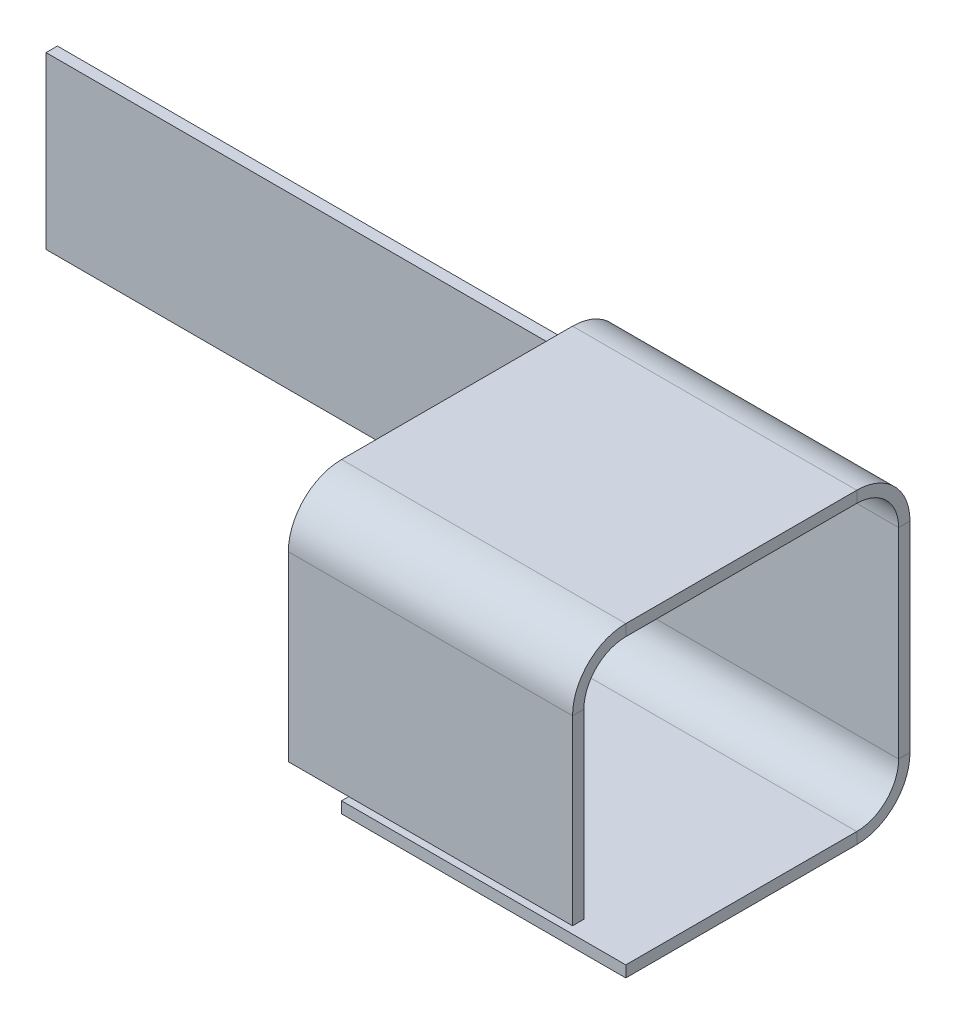
ISO-10303-21;
HEADER;
FILE_DESCRIPTION(('STEP AP214'),'2;1');
FILE_NAME('part.step','',(''),(''),'','','');
FILE_SCHEMA(('AUTOMOTIVE_DESIGN { 1 0 10303 214 1 1 1 1 }'));
ENDSEC;
DATA;
#1=APPLICATION_CONTEXT('core data for automotive mechanical design processes');
#2=APPLICATION_PROTOCOL_DEFINITION('international standard','automotive_design',2000,#1);
#3=PRODUCT_CONTEXT('',#1,'mechanical');
#4=PRODUCT('Part','Part','',(#3));
#5=PRODUCT_RELATED_PRODUCT_CATEGORY('part','',(#4));
#6=PRODUCT_DEFINITION_FORMATION('','',#4);
#7=PRODUCT_DEFINITION_CONTEXT('part definition',#1,'design');
#8=PRODUCT_DEFINITION('design','',#6,#7);
#9=PRODUCT_DEFINITION_SHAPE('','',#8);
#10=(LENGTH_UNIT() NAMED_UNIT(*) SI_UNIT(.MILLI.,.METRE.));
#11=(NAMED_UNIT(*) PLANE_ANGLE_UNIT() SI_UNIT($,.RADIAN.));
#12=(NAMED_UNIT(*) SI_UNIT($,.STERADIAN.) SOLID_ANGLE_UNIT());
#13=UNCERTAINTY_MEASURE_WITH_UNIT(LENGTH_MEASURE(1.E-05),#10,'distance_accuracy_value','');
#14=(GEOMETRIC_REPRESENTATION_CONTEXT(3) GLOBAL_UNCERTAINTY_ASSIGNED_CONTEXT((#13)) GLOBAL_UNIT_ASSIGNED_CONTEXT((#10,
#11,#12)) REPRESENTATION_CONTEXT('',''));
#15=CARTESIAN_POINT('',(0.,0.,0.));
#16=DIRECTION('',(0.,0.,1.));
#17=DIRECTION('',(1.,0.,0.));
#18=AXIS2_PLACEMENT_3D('',#15,#16,#17);
#19=CARTESIAN_POINT('',(-2.50000000000002,2.50000000000001,0.2));
#20=DIRECTION('',(1.,0.,0.));
#21=DIRECTION('',(0.,0.,-1.));
#22=AXIS2_PLACEMENT_3D('',#19,#20,#21);
#23=PLANE('',#22);
#24=DIRECTION('',(0.,0.,-1.));
#25=VECTOR('',#24,1.);
#26=CARTESIAN_POINT('',(-2.50000000000002,1.49999999999999,0.200000000000001));
#27=LINE('',#26,#25);
#28=CARTESIAN_POINT('',(-2.50000000000002,1.49999999999999,0.2));
#29=VERTEX_POINT('',#28);
#30=CARTESIAN_POINT('',(-2.50000000000002,1.49999999999999,0.));
#31=VERTEX_POINT('',#30);
#32=EDGE_CURVE('E77',#29,#31,#27,.T.);
#33=ORIENTED_EDGE('',*,*,#32,.F.);
#34=DIRECTION('',(0.,-1.,0.));
#35=VECTOR('',#34,1.);
#36=CARTESIAN_POINT('',(-2.50000000000002,2.50000000000001,0.2));
#37=LINE('',#36,#35);
#38=CARTESIAN_POINT('',(-2.50000000000002,1.76340000000001,0.200000000000001));
#39=VERTEX_POINT('',#38);
#40=EDGE_CURVE('E61',#39,#29,#37,.T.);
#41=ORIENTED_EDGE('',*,*,#40,.F.);
#42=DIRECTION('',(0.,0.,-1.));
#43=VECTOR('',#42,1.);
#44=CARTESIAN_POINT('',(-2.50000000000002,1.76340000000001,0.200000000000001));
#45=LINE('',#44,#43);
#46=CARTESIAN_POINT('',(-2.50000000000002,1.76340000000001,0.));
#47=VERTEX_POINT('',#46);
#48=EDGE_CURVE('E364',#39,#47,#45,.T.);
#49=ORIENTED_EDGE('',*,*,#48,.T.);
#50=DIRECTION('',(0.,-1.,0.));
#51=VECTOR('',#50,1.);
#52=CARTESIAN_POINT('',(-2.50000000000002,2.50000000000001,0.));
#53=LINE('',#52,#51);
#54=EDGE_CURVE('E381',#47,#31,#53,.T.);
#55=ORIENTED_EDGE('',*,*,#54,.T.);
#56=EDGE_LOOP('',(#33,#41,#49,#55));
#57=FACE_BOUND('',#56,.T.);
#58=ADVANCED_FACE('F53',(#57),#23,.F.);
#59=DIRECTION('',(0.,0.,1.));
#60=VECTOR('',#59,1.);
#61=CARTESIAN_POINT('',(-2.50000000000002,-1.50000000000001,0.200000000000002));
#62=LINE('',#61,#60);
#63=CARTESIAN_POINT('',(-2.50000000000002,-1.50000000000001,0.));
#64=VERTEX_POINT('',#63);
#65=CARTESIAN_POINT('',(-2.50000000000002,-1.50000000000001,0.2));
#66=VERTEX_POINT('',#65);
#67=EDGE_CURVE('E250',#64,#66,#62,.T.);
#68=ORIENTED_EDGE('',*,*,#67,.F.);
#69=CARTESIAN_POINT('',(-2.50000000000002,-1.76339999999999,0.));
#70=VERTEX_POINT('',#69);
#71=EDGE_CURVE('E378',#64,#70,#53,.T.);
#72=ORIENTED_EDGE('',*,*,#71,.T.);
#73=DIRECTION('',(0.,0.,-1.));
#74=VECTOR('',#73,1.);
#75=CARTESIAN_POINT('',(-2.50000000000002,-1.76339999999999,0.2));
#76=LINE('',#75,#74);
#77=CARTESIAN_POINT('',(-2.50000000000002,-1.76339999999999,0.2));
#78=VERTEX_POINT('',#77);
#79=EDGE_CURVE('E319',#78,#70,#76,.T.);
#80=ORIENTED_EDGE('',*,*,#79,.F.);
#81=EDGE_CURVE('E69',#66,#78,#37,.T.);
#82=ORIENTED_EDGE('',*,*,#81,.F.);
#83=EDGE_LOOP('',(#68,#72,#80,#82));
#84=FACE_BOUND('',#83,.T.);
#85=ADVANCED_FACE('F384',(#84),#23,.F.);
#86=CARTESIAN_POINT('',(2.49999999999997,2.50000000000001,0.2));
#87=DIRECTION('',(-1.,0.,0.));
#88=DIRECTION('',(0.,-1.,0.));
#89=AXIS2_PLACEMENT_3D('',#86,#87,#88);
#90=PLANE('',#89);
#91=DIRECTION('',(0.,0.,-1.));
#92=VECTOR('',#91,1.);
#93=CARTESIAN_POINT('',(2.49999999999999,-1.76339999999999,0.199999999999999));
#94=LINE('',#93,#92);
#95=CARTESIAN_POINT('',(2.49999999999999,-1.76339999999999,0.199999999999999));
#96=VERTEX_POINT('',#95);
#97=CARTESIAN_POINT('',(2.49999999999999,-1.76339999999999,0.));
#98=VERTEX_POINT('',#97);
#99=EDGE_CURVE('E308',#96,#98,#94,.T.);
#100=ORIENTED_EDGE('',*,*,#99,.T.);
#101=DIRECTION('',(0.,1.,0.));
#102=VECTOR('',#101,1.);
#103=CARTESIAN_POINT('',(2.49999999999997,2.50000000000001,0.));
#104=LINE('',#103,#102);
#105=CARTESIAN_POINT('',(2.49999999999998,1.76340000000002,0.));
#106=VERTEX_POINT('',#105);
#107=EDGE_CURVE('E56',#98,#106,#104,.T.);
#108=ORIENTED_EDGE('',*,*,#107,.T.);
#109=DIRECTION('',(0.,0.,-1.));
#110=VECTOR('',#109,1.);
#111=CARTESIAN_POINT('',(2.49999999999997,1.76340000000002,0.200000000000001));
#112=LINE('',#111,#110);
#113=CARTESIAN_POINT('',(2.49999999999997,1.76340000000002,0.200000000000001));
#114=VERTEX_POINT('',#113);
#115=EDGE_CURVE('E375',#114,#106,#112,.T.);
#116=ORIENTED_EDGE('',*,*,#115,.F.);
#117=DIRECTION('',(0.,1.,0.));
#118=VECTOR('',#117,1.);
#119=CARTESIAN_POINT('',(2.49999999999997,2.50000000000001,0.2));
#120=LINE('',#119,#118);
#121=EDGE_CURVE('E13',#96,#114,#120,.T.);
#122=ORIENTED_EDGE('',*,*,#121,.F.);
#123=EDGE_LOOP('',(#100,#108,#116,#122));
#124=FACE_BOUND('',#123,.T.);
#125=ADVANCED_FACE('F398',(#124),#90,.F.);
#126=CARTESIAN_POINT('',(-2.50000000000002,-2.49999999999999,0.2));
#127=DIRECTION('',(0.,0.,-1.));
#128=DIRECTION('',(-1.,0.,0.));
#129=AXIS2_PLACEMENT_3D('',#126,#127,#128);
#130=PLANE('',#129);
#131=DIRECTION('',(1.,0.,0.));
#132=VECTOR('',#131,1.);
#133=CARTESIAN_POINT('',(2.49999999999999,-1.76339999999999,0.199999999999999));
#134=LINE('',#133,#132);
#135=EDGE_CURVE('E314',#96,#78,#134,.F.);
#136=ORIENTED_EDGE('',*,*,#135,.F.);
#137=ORIENTED_EDGE('',*,*,#121,.T.);
#138=DIRECTION('',(-1.,0.,0.));
#139=VECTOR('',#138,1.);
#140=CARTESIAN_POINT('',(-2.50000000000002,1.76340000000001,0.200000000000001));
#141=LINE('',#140,#139);
#142=EDGE_CURVE('E370',#39,#114,#141,.F.);
#143=ORIENTED_EDGE('',*,*,#142,.F.);
#144=ORIENTED_EDGE('',*,*,#40,.T.);
#145=DIRECTION('',(1.,0.,0.));
#146=VECTOR('',#145,1.);
#147=CARTESIAN_POINT('',(-12.5,1.49999999999999,0.200000000000001));
#148=LINE('',#147,#146);
#149=CARTESIAN_POINT('',(-12.5,1.49999999999999,0.200000000000001));
#150=VERTEX_POINT('',#149);
#151=EDGE_CURVE('E267',#150,#29,#148,.T.);
#152=ORIENTED_EDGE('',*,*,#151,.F.);
#153=DIRECTION('',(0.,1.,0.));
#154=VECTOR('',#153,1.);
#155=CARTESIAN_POINT('',(-12.5,1.49999999999999,0.200000000000001));
#156=LINE('',#155,#154);
#157=CARTESIAN_POINT('',(-12.5,-1.50000000000001,0.200000000000002));
#158=VERTEX_POINT('',#157);
#159=EDGE_CURVE('E246',#158,#150,#156,.T.);
#160=ORIENTED_EDGE('',*,*,#159,.F.);
#161=DIRECTION('',(1.,0.,0.));
#162=VECTOR('',#161,1.);
#163=CARTESIAN_POINT('',(-12.5,-1.50000000000001,0.200000000000002));
#164=LINE('',#163,#162);
#165=EDGE_CURVE('E256',#158,#66,#164,.T.);
#166=ORIENTED_EDGE('',*,*,#165,.T.);
#167=ORIENTED_EDGE('',*,*,#81,.T.);
#168=EDGE_LOOP('',(#136,#137,#143,#144,#152,#160,#166,#167));
#169=FACE_BOUND('',#168,.T.);
#170=ADVANCED_FACE('F448',(#169),#130,.F.);
#171=CARTESIAN_POINT('',(-2.50000000000002,-2.49999999999999,0.));
#172=DIRECTION('',(0.,0.,-1.));
#173=DIRECTION('',(-1.,0.,0.));
#174=AXIS2_PLACEMENT_3D('',#171,#172,#173);
#175=PLANE('',#174);
#176=ORIENTED_EDGE('',*,*,#107,.F.);
#177=DIRECTION('',(1.,0.,0.));
#178=VECTOR('',#177,1.);
#179=CARTESIAN_POINT('',(2.49999999999999,-1.76339999999999,0.));
#180=LINE('',#179,#178);
#181=EDGE_CURVE('E301',#98,#70,#180,.F.);
#182=ORIENTED_EDGE('',*,*,#181,.T.);
#183=ORIENTED_EDGE('',*,*,#71,.F.);
#184=DIRECTION('',(1.,0.,0.));
#185=VECTOR('',#184,1.);
#186=CARTESIAN_POINT('',(-12.5,-1.50000000000001,0.));
#187=LINE('',#186,#185);
#188=CARTESIAN_POINT('',(-12.5,-1.50000000000001,0.));
#189=VERTEX_POINT('',#188);
#190=EDGE_CURVE('E261',#189,#64,#187,.T.);
#191=ORIENTED_EDGE('',*,*,#190,.F.);
#192=DIRECTION('',(0.,-1.,0.));
#193=VECTOR('',#192,1.);
#194=CARTESIAN_POINT('',(-12.5,1.49999999999999,0.));
#195=LINE('',#194,#193);
#196=CARTESIAN_POINT('',(-12.5,1.49999999999999,0.));
#197=VERTEX_POINT('',#196);
#198=EDGE_CURVE('E252',#197,#189,#195,.T.);
#199=ORIENTED_EDGE('',*,*,#198,.F.);
#200=DIRECTION('',(1.,0.,0.));
#201=VECTOR('',#200,1.);
#202=CARTESIAN_POINT('',(-12.5,1.49999999999999,0.));
#203=LINE('',#202,#201);
#204=EDGE_CURVE('E264',#197,#31,#203,.T.);
#205=ORIENTED_EDGE('',*,*,#204,.T.);
#206=ORIENTED_EDGE('',*,*,#54,.F.);
#207=DIRECTION('',(-1.,0.,0.));
#208=VECTOR('',#207,1.);
#209=CARTESIAN_POINT('',(-2.50000000000002,1.76340000000001,0.));
#210=LINE('',#209,#208);
#211=EDGE_CURVE('E357',#47,#106,#210,.F.);
#212=ORIENTED_EDGE('',*,*,#211,.T.);
#213=EDGE_LOOP('',(#176,#182,#183,#191,#199,#205,#206,#212));
#214=FACE_BOUND('',#213,.T.);
#215=ADVANCED_FACE('F394',(#214),#175,.T.);
#216=CARTESIAN_POINT('',(2.49999999999997,1.76340000000001,0.936600000000001));
#217=DIRECTION('',(1.,0.,0.));
#218=DIRECTION('',(0.,1.,0.));
#219=AXIS2_PLACEMENT_3D('',#216,#217,#218);
#220=PLANE('',#219);
#221=DIRECTION('',(0.,1.,0.));
#222=VECTOR('',#221,1.);
#223=CARTESIAN_POINT('',(2.49999999999997,2.50000000000001,0.936599999999998));
#224=LINE('',#223,#222);
#225=CARTESIAN_POINT('',(2.49999999999997,2.50000000000001,0.936599999999998));
#226=VERTEX_POINT('',#225);
#227=CARTESIAN_POINT('',(2.49999999999997,2.70000000000001,0.936599999999997));
#228=VERTEX_POINT('',#227);
#229=EDGE_CURVE('E322',#226,#228,#224,.T.);
#230=ORIENTED_EDGE('',*,*,#229,.F.);
#231=CARTESIAN_POINT('',(2.49999999999997,1.76340000000001,0.936600000000001));
#232=DIRECTION('',(-1.,0.,0.));
#233=DIRECTION('',(0.,-1.,0.));
#234=AXIS2_PLACEMENT_3D('',#231,#232,#233);
#235=CIRCLE('',#234,0.7366);
#236=EDGE_CURVE('E367',#114,#226,#235,.F.);
#237=ORIENTED_EDGE('',*,*,#236,.F.);
#238=ORIENTED_EDGE('',*,*,#115,.T.);
#239=CARTESIAN_POINT('',(2.49999999999997,1.76340000000001,0.936600000000001));
#240=DIRECTION('',(-1.,0.,0.));
#241=DIRECTION('',(0.,-1.,0.));
#242=AXIS2_PLACEMENT_3D('',#239,#240,#241);
#243=CIRCLE('',#242,0.9366);
#244=EDGE_CURVE('E360',#106,#228,#243,.F.);
#245=ORIENTED_EDGE('',*,*,#244,.T.);
#246=EDGE_LOOP('',(#230,#237,#238,#245));
#247=FACE_BOUND('',#246,.T.);
#248=ADVANCED_FACE('F405',(#247),#220,.T.);
#249=CARTESIAN_POINT('',(-2.50000000000002,1.76340000000001,0.936600000000001));
#250=DIRECTION('',(1.,0.,0.));
#251=DIRECTION('',(0.,1.,0.));
#252=AXIS2_PLACEMENT_3D('',#249,#250,#251);
#253=PLANE('',#252);
#254=CARTESIAN_POINT('',(-2.50000000000002,1.76340000000001,0.936600000000001));
#255=DIRECTION('',(-1.,0.,0.));
#256=DIRECTION('',(0.,-1.,0.));
#257=AXIS2_PLACEMENT_3D('',#254,#255,#256);
#258=CIRCLE('',#257,0.7366);
#259=CARTESIAN_POINT('',(-2.50000000000002,2.50000000000001,0.936599999999998));
#260=VERTEX_POINT('',#259);
#261=EDGE_CURVE('E356',#260,#39,#258,.T.);
#262=ORIENTED_EDGE('',*,*,#261,.F.);
#263=DIRECTION('',(0.,1.,0.));
#264=VECTOR('',#263,1.);
#265=CARTESIAN_POINT('',(-2.50000000000002,2.50000000000001,0.936599999999998));
#266=LINE('',#265,#264);
#267=CARTESIAN_POINT('',(-2.50000000000002,2.70000000000001,0.936599999999998));
#268=VERTEX_POINT('',#267);
#269=EDGE_CURVE('E327',#260,#268,#266,.T.);
#270=ORIENTED_EDGE('',*,*,#269,.T.);
#271=CARTESIAN_POINT('',(-2.50000000000002,1.76340000000001,0.936600000000001));
#272=DIRECTION('',(-1.,0.,0.));
#273=DIRECTION('',(0.,-1.,0.));
#274=AXIS2_PLACEMENT_3D('',#271,#272,#273);
#275=CIRCLE('',#274,0.9366);
#276=EDGE_CURVE('E361',#268,#47,#275,.T.);
#277=ORIENTED_EDGE('',*,*,#276,.T.);
#278=ORIENTED_EDGE('',*,*,#48,.F.);
#279=EDGE_LOOP('',(#262,#270,#277,#278));
#280=FACE_BOUND('',#279,.T.);
#281=ADVANCED_FACE('F445',(#280),#253,.F.);
#282=CARTESIAN_POINT('',(-2.50000000000002,1.76340000000001,0.936600000000001));
#283=DIRECTION('',(-1.,0.,0.));
#284=DIRECTION('',(0.,1.,0.));
#285=AXIS2_PLACEMENT_3D('',#282,#283,#284);
#286=CYLINDRICAL_SURFACE('',#285,0.9366);
#287=ORIENTED_EDGE('',*,*,#211,.F.);
#288=ORIENTED_EDGE('',*,*,#276,.F.);
#289=DIRECTION('',(1.,0.,0.));
#290=VECTOR('',#289,1.);
#291=CARTESIAN_POINT('',(2.49999999999997,2.70000000000001,0.936599999999997));
#292=LINE('',#291,#290);
#293=EDGE_CURVE('E330',#268,#228,#292,.T.);
#294=ORIENTED_EDGE('',*,*,#293,.T.);
#295=ORIENTED_EDGE('',*,*,#244,.F.);
#296=EDGE_LOOP('',(#287,#288,#294,#295));
#297=FACE_BOUND('',#296,.T.);
#298=ADVANCED_FACE('F401',(#297),#286,.T.);
#299=CARTESIAN_POINT('',(-2.50000000000002,1.76340000000001,0.936600000000001));
#300=DIRECTION('',(-1.,0.,0.));
#301=DIRECTION('',(0.,1.,0.));
#302=AXIS2_PLACEMENT_3D('',#299,#300,#301);
#303=CYLINDRICAL_SURFACE('',#302,0.7366);
#304=ORIENTED_EDGE('',*,*,#142,.T.);
#305=ORIENTED_EDGE('',*,*,#236,.T.);
#306=DIRECTION('',(-1.,0.,0.));
#307=VECTOR('',#306,1.);
#308=CARTESIAN_POINT('',(2.49999999999997,2.50000000000001,0.936599999999998));
#309=LINE('',#308,#307);
#310=EDGE_CURVE('E325',#226,#260,#309,.T.);
#311=ORIENTED_EDGE('',*,*,#310,.T.);
#312=ORIENTED_EDGE('',*,*,#261,.T.);
#313=EDGE_LOOP('',(#304,#305,#311,#312));
#314=FACE_BOUND('',#313,.T.);
#315=ADVANCED_FACE('F408',(#314),#303,.F.);
#316=CARTESIAN_POINT('',(2.49999999999997,2.70000000000001,0.199999999999999));
#317=DIRECTION('',(-1.,0.,0.));
#318=DIRECTION('',(0.,-1.,0.));
#319=AXIS2_PLACEMENT_3D('',#316,#317,#318);
#320=PLANE('',#319);
#321=ORIENTED_EDGE('',*,*,#229,.T.);
#322=DIRECTION('',(0.,0.,-1.));
#323=VECTOR('',#322,1.);
#324=CARTESIAN_POINT('',(2.49999999999997,2.70000000000001,0.199999999999999));
#325=LINE('',#324,#323);
#326=CARTESIAN_POINT('',(2.49999999999997,2.70000000000003,5.));
#327=VERTEX_POINT('',#326);
#328=EDGE_CURVE('E335',#327,#228,#325,.T.);
#329=ORIENTED_EDGE('',*,*,#328,.F.);
#330=DIRECTION('',(0.,-1.,0.));
#331=VECTOR('',#330,1.);
#332=CARTESIAN_POINT('',(2.49999999999997,2.70000000000003,5.));
#333=LINE('',#332,#331);
#334=CARTESIAN_POINT('',(2.49999999999997,2.50000000000003,5.));
#335=VERTEX_POINT('',#334);
#336=EDGE_CURVE('E345',#327,#335,#333,.T.);
#337=ORIENTED_EDGE('',*,*,#336,.T.);
#338=DIRECTION('',(0.,0.,-1.));
#339=VECTOR('',#338,1.);
#340=CARTESIAN_POINT('',(2.49999999999997,2.50000000000001,0.2));
#341=LINE('',#340,#339);
#342=EDGE_CURVE('E334',#335,#226,#341,.T.);
#343=ORIENTED_EDGE('',*,*,#342,.T.);
#344=EDGE_LOOP('',(#321,#329,#337,#343));
#345=FACE_BOUND('',#344,.T.);
#346=ADVANCED_FACE('F417',(#345),#320,.F.);
#347=CARTESIAN_POINT('',(-2.50000000000002,2.70000000000003,5.));
#348=DIRECTION('',(1.,0.,0.));
#349=DIRECTION('',(0.,1.,0.));
#350=AXIS2_PLACEMENT_3D('',#347,#348,#349);
#351=PLANE('',#350);
#352=ORIENTED_EDGE('',*,*,#269,.F.);
#353=DIRECTION('',(0.,0.,1.));
#354=VECTOR('',#353,1.);
#355=CARTESIAN_POINT('',(-2.50000000000002,2.50000000000003,5.));
#356=LINE('',#355,#354);
#357=CARTESIAN_POINT('',(-2.50000000000002,2.50000000000003,5.));
#358=VERTEX_POINT('',#357);
#359=EDGE_CURVE('E348',#260,#358,#356,.T.);
#360=ORIENTED_EDGE('',*,*,#359,.T.);
#361=DIRECTION('',(0.,-1.,0.));
#362=VECTOR('',#361,1.);
#363=CARTESIAN_POINT('',(-2.50000000000002,2.70000000000003,5.));
#364=LINE('',#363,#362);
#365=CARTESIAN_POINT('',(-2.50000000000002,2.70000000000003,5.));
#366=VERTEX_POINT('',#365);
#367=EDGE_CURVE('E354',#366,#358,#364,.T.);
#368=ORIENTED_EDGE('',*,*,#367,.F.);
#369=DIRECTION('',(0.,0.,1.));
#370=VECTOR('',#369,1.);
#371=CARTESIAN_POINT('',(-2.50000000000002,2.70000000000003,5.));
#372=LINE('',#371,#370);
#373=EDGE_CURVE('E338',#268,#366,#372,.T.);
#374=ORIENTED_EDGE('',*,*,#373,.F.);
#375=EDGE_LOOP('',(#352,#360,#368,#374));
#376=FACE_BOUND('',#375,.T.);
#377=ADVANCED_FACE('F443',(#376),#351,.F.);
#378=CARTESIAN_POINT('',(2.49999999999997,2.70000000000003,5.));
#379=DIRECTION('',(0.,-1.,0.));
#380=DIRECTION('',(0.,0.,-1.));
#381=AXIS2_PLACEMENT_3D('',#378,#379,#380);
#382=PLANE('',#381);
#383=ORIENTED_EDGE('',*,*,#293,.F.);
#384=ORIENTED_EDGE('',*,*,#373,.T.);
#385=DIRECTION('',(1.,0.,0.));
#386=VECTOR('',#385,1.);
#387=CARTESIAN_POINT('',(2.49999999999997,2.70000000000003,5.));
#388=LINE('',#387,#386);
#389=EDGE_CURVE('E342',#366,#327,#388,.T.);
#390=ORIENTED_EDGE('',*,*,#389,.T.);
#391=ORIENTED_EDGE('',*,*,#328,.T.);
#392=EDGE_LOOP('',(#383,#384,#390,#391));
#393=FACE_BOUND('',#392,.T.);
#394=ADVANCED_FACE('F424',(#393),#382,.F.);
#395=CARTESIAN_POINT('',(2.49999999999997,2.50000000000003,5.));
#396=DIRECTION('',(0.,-1.,0.));
#397=DIRECTION('',(0.,0.,-1.));
#398=AXIS2_PLACEMENT_3D('',#395,#396,#397);
#399=PLANE('',#398);
#400=ORIENTED_EDGE('',*,*,#359,.F.);
#401=ORIENTED_EDGE('',*,*,#310,.F.);
#402=ORIENTED_EDGE('',*,*,#342,.F.);
#403=DIRECTION('',(1.,0.,0.));
#404=VECTOR('',#403,1.);
#405=CARTESIAN_POINT('',(2.49999999999997,2.50000000000003,5.));
#406=LINE('',#405,#404);
#407=EDGE_CURVE('E339',#358,#335,#406,.T.);
#408=ORIENTED_EDGE('',*,*,#407,.F.);
#409=EDGE_LOOP('',(#400,#401,#402,#408));
#410=FACE_BOUND('',#409,.T.);
#411=ADVANCED_FACE('F414',(#410),#399,.T.);
#412=CARTESIAN_POINT('',(-2.50000000000002,-1.76339999999999,0.9366));
#413=DIRECTION('',(-1.,0.,0.));
#414=DIRECTION('',(0.,0.,1.));
#415=AXIS2_PLACEMENT_3D('',#412,#413,#414);
#416=PLANE('',#415);
#417=DIRECTION('',(0.,-1.,0.));
#418=VECTOR('',#417,1.);
#419=CARTESIAN_POINT('',(-2.50000000000002,-2.49999999999999,0.936599999999998));
#420=LINE('',#419,#418);
#421=CARTESIAN_POINT('',(-2.50000000000002,-2.49999999999999,0.936599999999998));
#422=VERTEX_POINT('',#421);
#423=CARTESIAN_POINT('',(-2.50000000000002,-2.69999999999999,0.936599999999997));
#424=VERTEX_POINT('',#423);
#425=EDGE_CURVE('E270',#422,#424,#420,.T.);
#426=ORIENTED_EDGE('',*,*,#425,.F.);
#427=CARTESIAN_POINT('',(-2.50000000000002,-1.76339999999999,0.9366));
#428=DIRECTION('',(1.,0.,0.));
#429=DIRECTION('',(0.,0.,-1.));
#430=AXIS2_PLACEMENT_3D('',#427,#428,#429);
#431=CIRCLE('',#430,0.7366);
#432=EDGE_CURVE('E311',#78,#422,#431,.F.);
#433=ORIENTED_EDGE('',*,*,#432,.F.);
#434=ORIENTED_EDGE('',*,*,#79,.T.);
#435=CARTESIAN_POINT('',(-2.50000000000002,-1.76339999999999,0.9366));
#436=DIRECTION('',(1.,0.,0.));
#437=DIRECTION('',(0.,0.,-1.));
#438=AXIS2_PLACEMENT_3D('',#435,#436,#437);
#439=CIRCLE('',#438,0.9366);
#440=EDGE_CURVE('E304',#70,#424,#439,.F.);
#441=ORIENTED_EDGE('',*,*,#440,.T.);
#442=EDGE_LOOP('',(#426,#433,#434,#441));
#443=FACE_BOUND('',#442,.T.);
#444=ADVANCED_FACE('F392',(#443),#416,.T.);
#445=CARTESIAN_POINT('',(2.49999999999999,-1.76339999999999,0.9366));
#446=DIRECTION('',(-1.,0.,0.));
#447=DIRECTION('',(0.,0.,1.));
#448=AXIS2_PLACEMENT_3D('',#445,#446,#447);
#449=PLANE('',#448);
#450=CARTESIAN_POINT('',(2.49999999999999,-1.76339999999999,0.9366));
#451=DIRECTION('',(1.,0.,0.));
#452=DIRECTION('',(0.,0.,-1.));
#453=AXIS2_PLACEMENT_3D('',#450,#451,#452);
#454=CIRCLE('',#453,0.7366);
#455=CARTESIAN_POINT('',(2.49999999999999,-2.49999999999999,0.936599999999997));
#456=VERTEX_POINT('',#455);
#457=EDGE_CURVE('E300',#456,#96,#454,.T.);
#458=ORIENTED_EDGE('',*,*,#457,.F.);
#459=DIRECTION('',(0.,-1.,0.));
#460=VECTOR('',#459,1.);
#461=CARTESIAN_POINT('',(2.49999999999999,-2.49999999999999,0.936599999999997));
#462=LINE('',#461,#460);
#463=CARTESIAN_POINT('',(2.49999999999999,-2.69999999999999,0.936599999999997));
#464=VERTEX_POINT('',#463);
#465=EDGE_CURVE('E273',#456,#464,#462,.T.);
#466=ORIENTED_EDGE('',*,*,#465,.T.);
#467=CARTESIAN_POINT('',(2.49999999999999,-1.76339999999999,0.9366));
#468=DIRECTION('',(1.,0.,0.));
#469=DIRECTION('',(0.,0.,-1.));
#470=AXIS2_PLACEMENT_3D('',#467,#468,#469);
#471=CIRCLE('',#470,0.9366);
#472=EDGE_CURVE('E305',#464,#98,#471,.T.);
#473=ORIENTED_EDGE('',*,*,#472,.T.);
#474=ORIENTED_EDGE('',*,*,#99,.F.);
#475=EDGE_LOOP('',(#458,#466,#473,#474));
#476=FACE_BOUND('',#475,.T.);
#477=ADVANCED_FACE('F500',(#476),#449,.F.);
#478=CARTESIAN_POINT('',(2.49999999999999,-1.76339999999999,0.9366));
#479=DIRECTION('',(1.,0.,0.));
#480=DIRECTION('',(0.,-1.,0.));
#481=AXIS2_PLACEMENT_3D('',#478,#479,#480);
#482=CYLINDRICAL_SURFACE('',#481,0.9366);
#483=ORIENTED_EDGE('',*,*,#181,.F.);
#484=ORIENTED_EDGE('',*,*,#472,.F.);
#485=DIRECTION('',(-1.,0.,0.));
#486=VECTOR('',#485,1.);
#487=CARTESIAN_POINT('',(-2.50000000000002,-2.69999999999999,0.936599999999997));
#488=LINE('',#487,#486);
#489=EDGE_CURVE('E276',#464,#424,#488,.T.);
#490=ORIENTED_EDGE('',*,*,#489,.T.);
#491=ORIENTED_EDGE('',*,*,#440,.F.);
#492=EDGE_LOOP('',(#483,#484,#490,#491));
#493=FACE_BOUND('',#492,.T.);
#494=ADVANCED_FACE('F388',(#493),#482,.T.);
#495=CARTESIAN_POINT('',(2.49999999999999,-1.76339999999999,0.9366));
#496=DIRECTION('',(1.,0.,0.));
#497=DIRECTION('',(0.,-1.,0.));
#498=AXIS2_PLACEMENT_3D('',#495,#496,#497);
#499=CYLINDRICAL_SURFACE('',#498,0.7366);
#500=ORIENTED_EDGE('',*,*,#135,.T.);
#501=ORIENTED_EDGE('',*,*,#432,.T.);
#502=DIRECTION('',(1.,0.,0.));
#503=VECTOR('',#502,1.);
#504=CARTESIAN_POINT('',(-2.50000000000002,-2.49999999999999,0.936599999999998));
#505=LINE('',#504,#503);
#506=EDGE_CURVE('E271',#422,#456,#505,.T.);
#507=ORIENTED_EDGE('',*,*,#506,.T.);
#508=ORIENTED_EDGE('',*,*,#457,.T.);
#509=EDGE_LOOP('',(#500,#501,#507,#508));
#510=FACE_BOUND('',#509,.T.);
#511=ADVANCED_FACE('F504',(#510),#499,.F.);
#512=CARTESIAN_POINT('',(-2.50000000000002,-2.69999999999999,0.199999999999999));
#513=DIRECTION('',(1.,0.,0.));
#514=DIRECTION('',(0.,1.,0.));
#515=AXIS2_PLACEMENT_3D('',#512,#513,#514);
#516=PLANE('',#515);
#517=ORIENTED_EDGE('',*,*,#425,.T.);
#518=DIRECTION('',(0.,0.,-1.));
#519=VECTOR('',#518,1.);
#520=CARTESIAN_POINT('',(-2.50000000000002,-2.69999999999999,0.199999999999999));
#521=LINE('',#520,#519);
#522=CARTESIAN_POINT('',(-2.50000000000002,-2.70000000000001,5.));
#523=VERTEX_POINT('',#522);
#524=EDGE_CURVE('E281',#523,#424,#521,.T.);
#525=ORIENTED_EDGE('',*,*,#524,.F.);
#526=DIRECTION('',(0.,1.,0.));
#527=VECTOR('',#526,1.);
#528=CARTESIAN_POINT('',(-2.50000000000002,-2.70000000000001,5.));
#529=LINE('',#528,#527);
#530=CARTESIAN_POINT('',(-2.50000000000002,-2.50000000000001,5.));
#531=VERTEX_POINT('',#530);
#532=EDGE_CURVE('E289',#523,#531,#529,.T.);
#533=ORIENTED_EDGE('',*,*,#532,.T.);
#534=DIRECTION('',(0.,0.,-1.));
#535=VECTOR('',#534,1.);
#536=CARTESIAN_POINT('',(-2.50000000000002,-2.49999999999999,0.2));
#537=LINE('',#536,#535);
#538=EDGE_CURVE('E280',#531,#422,#537,.T.);
#539=ORIENTED_EDGE('',*,*,#538,.T.);
#540=EDGE_LOOP('',(#517,#525,#533,#539));
#541=FACE_BOUND('',#540,.T.);
#542=ADVANCED_FACE('F509',(#541),#516,.F.);
#543=CARTESIAN_POINT('',(2.49999999999999,-2.70000000000001,5.));
#544=DIRECTION('',(-1.,0.,0.));
#545=DIRECTION('',(0.,-1.,0.));
#546=AXIS2_PLACEMENT_3D('',#543,#544,#545);
#547=PLANE('',#546);
#548=ORIENTED_EDGE('',*,*,#465,.F.);
#549=DIRECTION('',(0.,0.,1.));
#550=VECTOR('',#549,1.);
#551=CARTESIAN_POINT('',(2.49999999999999,-2.5,5.));
#552=LINE('',#551,#550);
#553=CARTESIAN_POINT('',(2.49999999999999,-2.5,5.));
#554=VERTEX_POINT('',#553);
#555=EDGE_CURVE('E292',#456,#554,#552,.T.);
#556=ORIENTED_EDGE('',*,*,#555,.T.);
#557=DIRECTION('',(0.,1.,0.));
#558=VECTOR('',#557,1.);
#559=CARTESIAN_POINT('',(2.49999999999999,-2.70000000000001,5.));
#560=LINE('',#559,#558);
#561=CARTESIAN_POINT('',(2.49999999999999,-2.70000000000001,5.));
#562=VERTEX_POINT('',#561);
#563=EDGE_CURVE('E297',#562,#554,#560,.T.);
#564=ORIENTED_EDGE('',*,*,#563,.F.);
#565=DIRECTION('',(0.,0.,1.));
#566=VECTOR('',#565,1.);
#567=CARTESIAN_POINT('',(2.49999999999999,-2.70000000000001,5.));
#568=LINE('',#567,#566);
#569=EDGE_CURVE('E284',#464,#562,#568,.T.);
#570=ORIENTED_EDGE('',*,*,#569,.F.);
#571=EDGE_LOOP('',(#548,#556,#564,#570));
#572=FACE_BOUND('',#571,.T.);
#573=ADVANCED_FACE('F515',(#572),#547,.F.);
#574=CARTESIAN_POINT('',(-2.50000000000002,-2.70000000000001,5.));
#575=DIRECTION('',(0.,1.,0.));
#576=DIRECTION('',(0.,0.,1.));
#577=AXIS2_PLACEMENT_3D('',#574,#575,#576);
#578=PLANE('',#577);
#579=ORIENTED_EDGE('',*,*,#489,.F.);
#580=ORIENTED_EDGE('',*,*,#569,.T.);
#581=DIRECTION('',(-1.,0.,0.));
#582=VECTOR('',#581,1.);
#583=CARTESIAN_POINT('',(-2.50000000000002,-2.70000000000001,5.));
#584=LINE('',#583,#582);
#585=EDGE_CURVE('E287',#562,#523,#584,.T.);
#586=ORIENTED_EDGE('',*,*,#585,.T.);
#587=ORIENTED_EDGE('',*,*,#524,.T.);
#588=EDGE_LOOP('',(#579,#580,#586,#587));
#589=FACE_BOUND('',#588,.T.);
#590=ADVANCED_FACE('F519',(#589),#578,.F.);
#591=CARTESIAN_POINT('',(-2.50000000000002,-2.50000000000001,5.));
#592=DIRECTION('',(0.,1.,0.));
#593=DIRECTION('',(0.,0.,1.));
#594=AXIS2_PLACEMENT_3D('',#591,#592,#593);
#595=PLANE('',#594);
#596=ORIENTED_EDGE('',*,*,#555,.F.);
#597=ORIENTED_EDGE('',*,*,#506,.F.);
#598=ORIENTED_EDGE('',*,*,#538,.F.);
#599=DIRECTION('',(-1.,0.,0.));
#600=VECTOR('',#599,1.);
#601=CARTESIAN_POINT('',(-2.50000000000002,-2.50000000000001,5.));
#602=LINE('',#601,#600);
#603=EDGE_CURVE('E285',#554,#531,#602,.T.);
#604=ORIENTED_EDGE('',*,*,#603,.F.);
#605=EDGE_LOOP('',(#596,#597,#598,#604));
#606=FACE_BOUND('',#605,.T.);
#607=ADVANCED_FACE('F523',(#606),#595,.T.);
#608=CARTESIAN_POINT('',(-2.50000000000002,-2.70000000000001,5.));
#609=DIRECTION('',(0.,0.,-1.));
#610=DIRECTION('',(0.,1.,0.));
#611=AXIS2_PLACEMENT_3D('',#608,#609,#610);
#612=PLANE('',#611);
#613=ORIENTED_EDGE('',*,*,#603,.T.);
#614=ORIENTED_EDGE('',*,*,#532,.F.);
#615=ORIENTED_EDGE('',*,*,#585,.F.);
#616=ORIENTED_EDGE('',*,*,#563,.T.);
#617=EDGE_LOOP('',(#613,#614,#615,#616));
#618=FACE_BOUND('',#617,.T.);
#619=ADVANCED_FACE('F468',(#618),#612,.F.);
#620=CARTESIAN_POINT('',(-12.5,1.49999999999999,0.200000000000001));
#621=DIRECTION('',(0.,-1.,0.));
#622=DIRECTION('',(0.,0.,-1.));
#623=AXIS2_PLACEMENT_3D('',#620,#621,#622);
#624=PLANE('',#623);
#625=ORIENTED_EDGE('',*,*,#32,.T.);
#626=ORIENTED_EDGE('',*,*,#204,.F.);
#627=DIRECTION('',(0.,0.,-1.));
#628=VECTOR('',#627,1.);
#629=CARTESIAN_POINT('',(-12.5,1.49999999999999,0.200000000000001));
#630=LINE('',#629,#628);
#631=EDGE_CURVE('E249',#150,#197,#630,.T.);
#632=ORIENTED_EDGE('',*,*,#631,.F.);
#633=ORIENTED_EDGE('',*,*,#151,.T.);
#634=EDGE_LOOP('',(#625,#626,#632,#633));
#635=FACE_BOUND('',#634,.T.);
#636=ADVANCED_FACE('F453',(#635),#624,.F.);
#637=CARTESIAN_POINT('',(-12.5,-1.50000000000001,0.200000000000002));
#638=DIRECTION('',(0.,1.,0.));
#639=DIRECTION('',(0.,0.,1.));
#640=AXIS2_PLACEMENT_3D('',#637,#638,#639);
#641=PLANE('',#640);
#642=ORIENTED_EDGE('',*,*,#67,.T.);
#643=ORIENTED_EDGE('',*,*,#165,.F.);
#644=DIRECTION('',(0.,0.,1.));
#645=VECTOR('',#644,1.);
#646=CARTESIAN_POINT('',(-12.5,-1.50000000000001,0.200000000000002));
#647=LINE('',#646,#645);
#648=EDGE_CURVE('E254',#189,#158,#647,.T.);
#649=ORIENTED_EDGE('',*,*,#648,.F.);
#650=ORIENTED_EDGE('',*,*,#190,.T.);
#651=EDGE_LOOP('',(#642,#643,#649,#650));
#652=FACE_BOUND('',#651,.T.);
#653=ADVANCED_FACE('F460',(#652),#641,.F.);
#654=CARTESIAN_POINT('',(-12.5,-1.50000000000001,0.200000000000002));
#655=DIRECTION('',(1.,0.,0.));
#656=DIRECTION('',(0.,0.,-1.));
#657=AXIS2_PLACEMENT_3D('',#654,#655,#656);
#658=PLANE('',#657);
#659=ORIENTED_EDGE('',*,*,#159,.T.);
#660=ORIENTED_EDGE('',*,*,#631,.T.);
#661=ORIENTED_EDGE('',*,*,#198,.T.);
#662=ORIENTED_EDGE('',*,*,#648,.T.);
#663=EDGE_LOOP('',(#659,#660,#661,#662));
#664=FACE_BOUND('',#663,.T.);
#665=ADVANCED_FACE('F457',(#664),#658,.F.);
#666=CARTESIAN_POINT('',(2.49999999999997,1.76340000000003,5.));
#667=DIRECTION('',(1.,0.,0.));
#668=DIRECTION('',(0.,0.,-1.));
#669=AXIS2_PLACEMENT_3D('',#666,#667,#668);
#670=PLANE('',#669);
#671=DIRECTION('',(0.,0.,-1.));
#672=VECTOR('',#671,1.);
#673=CARTESIAN_POINT('',(2.49999999999997,1.76340000000003,5.9366));
#674=LINE('',#673,#672);
#675=CARTESIAN_POINT('',(2.49999999999997,1.76340000000004,5.7366));
#676=VERTEX_POINT('',#675);
#677=CARTESIAN_POINT('',(2.49999999999997,1.76340000000004,5.9366));
#678=VERTEX_POINT('',#677);
#679=EDGE_CURVE('E216',#676,#678,#674,.F.);
#680=ORIENTED_EDGE('',*,*,#679,.F.);
#681=CARTESIAN_POINT('',(2.49999999999997,1.76340000000003,5.));
#682=DIRECTION('',(-1.,0.,0.));
#683=DIRECTION('',(0.,0.,1.));
#684=AXIS2_PLACEMENT_3D('',#681,#682,#683);
#685=CIRCLE('',#684,0.7366);
#686=EDGE_CURVE('E240',#335,#676,#685,.F.);
#687=ORIENTED_EDGE('',*,*,#686,.F.);
#688=ORIENTED_EDGE('',*,*,#336,.F.);
#689=CARTESIAN_POINT('',(2.49999999999997,1.76340000000003,5.));
#690=DIRECTION('',(-1.,0.,0.));
#691=DIRECTION('',(0.,0.,1.));
#692=AXIS2_PLACEMENT_3D('',#689,#690,#691);
#693=CIRCLE('',#692,0.9366);
#694=EDGE_CURVE('E234',#327,#678,#693,.F.);
#695=ORIENTED_EDGE('',*,*,#694,.T.);
#696=EDGE_LOOP('',(#680,#687,#688,#695));
#697=FACE_BOUND('',#696,.T.);
#698=ADVANCED_FACE('F422',(#697),#670,.T.);
#699=CARTESIAN_POINT('',(-2.50000000000002,1.76340000000003,5.));
#700=DIRECTION('',(1.,0.,0.));
#701=DIRECTION('',(0.,0.,-1.));
#702=AXIS2_PLACEMENT_3D('',#699,#700,#701);
#703=PLANE('',#702);
#704=CARTESIAN_POINT('',(-2.50000000000002,1.76340000000003,5.));
#705=DIRECTION('',(-1.,0.,0.));
#706=DIRECTION('',(0.,0.,1.));
#707=AXIS2_PLACEMENT_3D('',#704,#705,#706);
#708=CIRCLE('',#707,0.7366);
#709=CARTESIAN_POINT('',(-2.50000000000002,1.76340000000004,5.7366));
#710=VERTEX_POINT('',#709);
#711=EDGE_CURVE('E243',#710,#358,#708,.T.);
#712=ORIENTED_EDGE('',*,*,#711,.F.);
#713=DIRECTION('',(0.,0.,-1.));
#714=VECTOR('',#713,1.);
#715=CARTESIAN_POINT('',(-2.50000000000002,1.76340000000003,5.7366));
#716=LINE('',#715,#714);
#717=CARTESIAN_POINT('',(-2.50000000000002,1.76340000000003,5.9366));
#718=VERTEX_POINT('',#717);
#719=EDGE_CURVE('E228',#710,#718,#716,.F.);
#720=ORIENTED_EDGE('',*,*,#719,.T.);
#721=CARTESIAN_POINT('',(-2.50000000000002,1.76340000000003,5.));
#722=DIRECTION('',(-1.,0.,0.));
#723=DIRECTION('',(0.,0.,1.));
#724=AXIS2_PLACEMENT_3D('',#721,#722,#723);
#725=CIRCLE('',#724,0.9366);
#726=EDGE_CURVE('E237',#718,#366,#725,.T.);
#727=ORIENTED_EDGE('',*,*,#726,.T.);
#728=ORIENTED_EDGE('',*,*,#367,.T.);
#729=EDGE_LOOP('',(#712,#720,#727,#728));
#730=FACE_BOUND('',#729,.T.);
#731=ADVANCED_FACE('F431',(#730),#703,.F.);
#732=CARTESIAN_POINT('',(-2.50000000000002,1.76340000000003,5.));
#733=DIRECTION('',(-1.,0.,0.));
#734=DIRECTION('',(0.,0.,1.));
#735=AXIS2_PLACEMENT_3D('',#732,#733,#734);
#736=CYLINDRICAL_SURFACE('',#735,0.9366);
#737=ORIENTED_EDGE('',*,*,#389,.F.);
#738=ORIENTED_EDGE('',*,*,#726,.F.);
#739=DIRECTION('',(-1.,0.,0.));
#740=VECTOR('',#739,1.);
#741=CARTESIAN_POINT('',(2.49999999999997,1.76340000000003,5.9366));
#742=LINE('',#741,#740);
#743=EDGE_CURVE('E226',#718,#678,#742,.F.);
#744=ORIENTED_EDGE('',*,*,#743,.T.);
#745=ORIENTED_EDGE('',*,*,#694,.F.);
#746=EDGE_LOOP('',(#737,#738,#744,#745));
#747=FACE_BOUND('',#746,.T.);
#748=ADVANCED_FACE('F428',(#747),#736,.T.);
#749=CARTESIAN_POINT('',(-2.50000000000002,1.76340000000003,5.));
#750=DIRECTION('',(-1.,0.,0.));
#751=DIRECTION('',(0.,0.,1.));
#752=AXIS2_PLACEMENT_3D('',#749,#750,#751);
#753=CYLINDRICAL_SURFACE('',#752,0.7366);
#754=ORIENTED_EDGE('',*,*,#407,.T.);
#755=ORIENTED_EDGE('',*,*,#686,.T.);
#756=DIRECTION('',(-1.,0.,0.));
#757=VECTOR('',#756,1.);
#758=CARTESIAN_POINT('',(2.49999999999997,1.76340000000003,5.7366));
#759=LINE('',#758,#757);
#760=EDGE_CURVE('E231',#676,#710,#759,.T.);
#761=ORIENTED_EDGE('',*,*,#760,.T.);
#762=ORIENTED_EDGE('',*,*,#711,.T.);
#763=EDGE_LOOP('',(#754,#755,#761,#762));
#764=FACE_BOUND('',#763,.T.);
#765=ADVANCED_FACE('F440',(#764),#753,.F.);
#766=CARTESIAN_POINT('',(-2.50000000000002,-1.43659999999997,5.93660000000002));
#767=DIRECTION('',(1.,0.,0.));
#768=DIRECTION('',(0.,0.,-1.));
#769=AXIS2_PLACEMENT_3D('',#766,#767,#768);
#770=PLANE('',#769);
#771=ORIENTED_EDGE('',*,*,#719,.F.);
#772=DIRECTION('',(0.,1.,0.));
#773=VECTOR('',#772,1.);
#774=CARTESIAN_POINT('',(-2.50000000000002,-1.43659999999997,5.73660000000003));
#775=LINE('',#774,#773);
#776=CARTESIAN_POINT('',(-2.50000000000002,-1.43659999999997,5.73660000000003));
#777=VERTEX_POINT('',#776);
#778=EDGE_CURVE('E224',#710,#777,#775,.F.);
#779=ORIENTED_EDGE('',*,*,#778,.T.);
#780=DIRECTION('',(0.,0.,-1.));
#781=VECTOR('',#780,1.);
#782=CARTESIAN_POINT('',(-2.50000000000002,-1.43659999999997,5.93660000000002));
#783=LINE('',#782,#781);
#784=CARTESIAN_POINT('',(-2.50000000000002,-1.43659999999997,5.93660000000002));
#785=VERTEX_POINT('',#784);
#786=EDGE_CURVE('E212',#785,#777,#783,.T.);
#787=ORIENTED_EDGE('',*,*,#786,.F.);
#788=DIRECTION('',(0.,-1.,0.));
#789=VECTOR('',#788,1.);
#790=CARTESIAN_POINT('',(-2.50000000000002,2.50000000000003,5.9366));
#791=LINE('',#790,#789);
#792=EDGE_CURVE('E199',#718,#785,#791,.T.);
#793=ORIENTED_EDGE('',*,*,#792,.F.);
#794=EDGE_LOOP('',(#771,#779,#787,#793));
#795=FACE_BOUND('',#794,.T.);
#796=ADVANCED_FACE('F435',(#795),#770,.F.);
#797=CARTESIAN_POINT('',(2.49999999999997,2.50000000000003,5.9366));
#798=DIRECTION('',(-1.,0.,0.));
#799=DIRECTION('',(0.,0.,1.));
#800=AXIS2_PLACEMENT_3D('',#797,#798,#799);
#801=PLANE('',#800);
#802=ORIENTED_EDGE('',*,*,#679,.T.);
#803=DIRECTION('',(0.,1.,0.));
#804=VECTOR('',#803,1.);
#805=CARTESIAN_POINT('',(2.49999999999997,2.50000000000003,5.9366));
#806=LINE('',#805,#804);
#807=CARTESIAN_POINT('',(2.49999999999997,-1.43659999999997,5.93660000000002));
#808=VERTEX_POINT('',#807);
#809=EDGE_CURVE('E197',#808,#678,#806,.T.);
#810=ORIENTED_EDGE('',*,*,#809,.F.);
#811=DIRECTION('',(0.,0.,-1.));
#812=VECTOR('',#811,1.);
#813=CARTESIAN_POINT('',(2.49999999999997,-1.43659999999997,5.93660000000002));
#814=LINE('',#813,#812);
#815=CARTESIAN_POINT('',(2.49999999999997,-1.43659999999997,5.73660000000003));
#816=VERTEX_POINT('',#815);
#817=EDGE_CURVE('E205',#808,#816,#814,.T.);
#818=ORIENTED_EDGE('',*,*,#817,.T.);
#819=DIRECTION('',(0.,-1.,0.));
#820=VECTOR('',#819,1.);
#821=CARTESIAN_POINT('',(2.49999999999997,2.50000000000003,5.7366));
#822=LINE('',#821,#820);
#823=EDGE_CURVE('E221',#816,#676,#822,.F.);
#824=ORIENTED_EDGE('',*,*,#823,.T.);
#825=EDGE_LOOP('',(#802,#810,#818,#824));
#826=FACE_BOUND('',#825,.T.);
#827=ADVANCED_FACE('F215',(#826),#801,.F.);
#828=CARTESIAN_POINT('',(-2.50000000000002,2.50000000000003,5.9366));
#829=DIRECTION('',(0.,0.,-1.));
#830=DIRECTION('',(0.,1.,0.));
#831=AXIS2_PLACEMENT_3D('',#828,#829,#830);
#832=PLANE('',#831);
#833=ORIENTED_EDGE('',*,*,#743,.F.);
#834=ORIENTED_EDGE('',*,*,#792,.T.);
#835=DIRECTION('',(1.,0.,0.));
#836=VECTOR('',#835,1.);
#837=CARTESIAN_POINT('',(-2.50000000000002,-1.43659999999997,5.93660000000002));
#838=LINE('',#837,#836);
#839=EDGE_CURVE('E192',#785,#808,#838,.T.);
#840=ORIENTED_EDGE('',*,*,#839,.T.);
#841=ORIENTED_EDGE('',*,*,#809,.T.);
#842=EDGE_LOOP('',(#833,#834,#840,#841));
#843=FACE_BOUND('',#842,.T.);
#844=ADVANCED_FACE('F195',(#843),#832,.F.);
#845=CARTESIAN_POINT('',(-2.50000000000002,2.50000000000003,5.7366));
#846=DIRECTION('',(0.,0.,-1.));
#847=DIRECTION('',(0.,1.,0.));
#848=AXIS2_PLACEMENT_3D('',#845,#846,#847);
#849=PLANE('',#848);
#850=ORIENTED_EDGE('',*,*,#778,.F.);
#851=ORIENTED_EDGE('',*,*,#760,.F.);
#852=ORIENTED_EDGE('',*,*,#823,.F.);
#853=DIRECTION('',(-1.,0.,0.));
#854=VECTOR('',#853,1.);
#855=CARTESIAN_POINT('',(2.49999999999997,-1.43659999999997,5.73660000000003));
#856=LINE('',#855,#854);
#857=EDGE_CURVE('E208',#777,#816,#856,.F.);
#858=ORIENTED_EDGE('',*,*,#857,.F.);
#859=EDGE_LOOP('',(#850,#851,#852,#858));
#860=FACE_BOUND('',#859,.T.);
#861=ADVANCED_FACE('F438',(#860),#849,.T.);
#862=CARTESIAN_POINT('',(2.49999999999997,-1.43659999999997,5.93660000000002));
#863=DIRECTION('',(0.,1.,0.));
#864=DIRECTION('',(0.,0.,1.));
#865=AXIS2_PLACEMENT_3D('',#862,#863,#864);
#866=PLANE('',#865);
#867=ORIENTED_EDGE('',*,*,#857,.T.);
#868=ORIENTED_EDGE('',*,*,#817,.F.);
#869=ORIENTED_EDGE('',*,*,#839,.F.);
#870=ORIENTED_EDGE('',*,*,#786,.T.);
#871=EDGE_LOOP('',(#867,#868,#869,#870));
#872=FACE_BOUND('',#871,.T.);
#873=ADVANCED_FACE('F206',(#872),#866,.F.);
#874=CLOSED_SHELL('',(#58,#85,#125,#170,#215,#248,#281,#298,#315,#346,#377,#394,#411,#444,#477,
#494,#511,#542,#573,#590,#607,#619,#636,#653,#665,#698,#731,#748,#765,#796,#827,#844,#861,#873));
#875=MANIFOLD_SOLID_BREP('B2',#874);
#876=ADVANCED_BREP_SHAPE_REPRESENTATION('',(#18,#875),#14);
#877=SHAPE_DEFINITION_REPRESENTATION(#9,#876);
ENDSEC;
END-ISO-10303-21;
